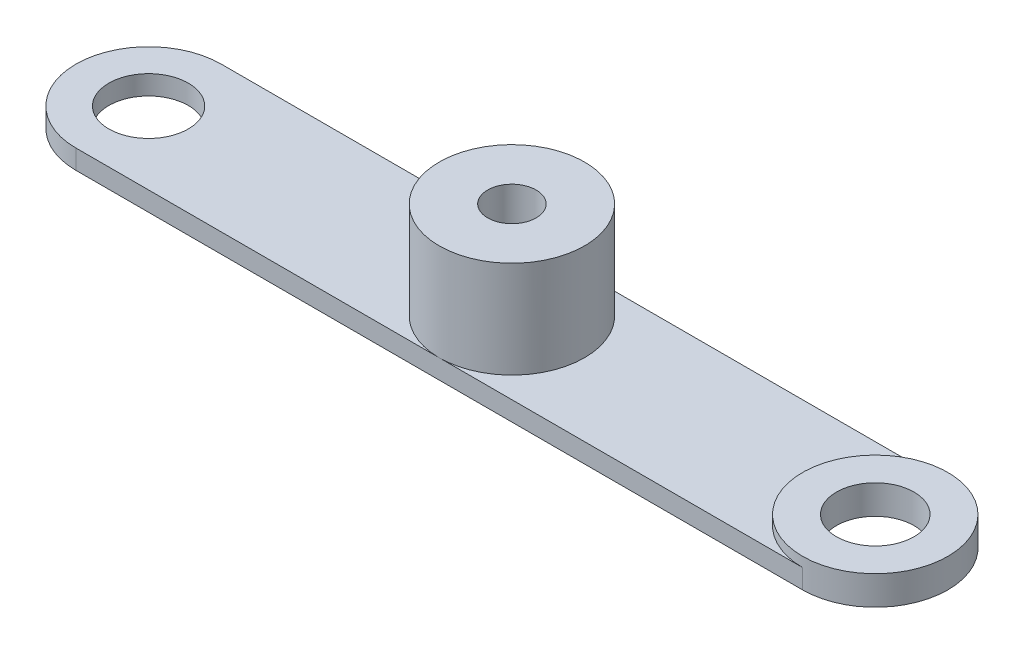
ISO-10303-21;
HEADER;
FILE_DESCRIPTION(('STEP AP214'),'2;1');
FILE_NAME('part.step','',(''),(''),'','','');
FILE_SCHEMA(('AUTOMOTIVE_DESIGN { 1 0 10303 214 1 1 1 1 }'));
ENDSEC;
DATA;
#1=APPLICATION_CONTEXT('core data for automotive mechanical design processes');
#2=APPLICATION_PROTOCOL_DEFINITION('international standard','automotive_design',2000,#1);
#3=PRODUCT_CONTEXT('',#1,'mechanical');
#4=PRODUCT('Part','Part','',(#3));
#5=PRODUCT_RELATED_PRODUCT_CATEGORY('part','',(#4));
#6=PRODUCT_DEFINITION_FORMATION('','',#4);
#7=PRODUCT_DEFINITION_CONTEXT('part definition',#1,'design');
#8=PRODUCT_DEFINITION('design','',#6,#7);
#9=PRODUCT_DEFINITION_SHAPE('','',#8);
#10=(LENGTH_UNIT() NAMED_UNIT(*) SI_UNIT(.MILLI.,.METRE.));
#11=(NAMED_UNIT(*) PLANE_ANGLE_UNIT() SI_UNIT($,.RADIAN.));
#12=(NAMED_UNIT(*) SI_UNIT($,.STERADIAN.) SOLID_ANGLE_UNIT());
#13=UNCERTAINTY_MEASURE_WITH_UNIT(LENGTH_MEASURE(1.E-05),#10,'distance_accuracy_value','');
#14=(GEOMETRIC_REPRESENTATION_CONTEXT(3) GLOBAL_UNCERTAINTY_ASSIGNED_CONTEXT((#13)) GLOBAL_UNIT_ASSIGNED_CONTEXT((#10,
#11,#12)) REPRESENTATION_CONTEXT('',''));
#15=CARTESIAN_POINT('',(0.,0.,0.));
#16=DIRECTION('',(0.,0.,1.));
#17=DIRECTION('',(1.,0.,0.));
#18=AXIS2_PLACEMENT_3D('',#15,#16,#17);
#19=CARTESIAN_POINT('',(-37.5,2.,0.));
#20=DIRECTION('',(0.,1.,0.));
#21=DIRECTION('',(0.,0.,1.));
#22=AXIS2_PLACEMENT_3D('',#19,#20,#21);
#23=PLANE('',#22);
#24=DIRECTION('',(1.,0.,0.));
#25=VECTOR('',#24,1.);
#26=CARTESIAN_POINT('',(-37.5,2.,7.5));
#27=LINE('',#26,#25);
#28=CARTESIAN_POINT('',(0.,2.,7.50000000000001));
#29=VERTEX_POINT('',#28);
#30=CARTESIAN_POINT('',(37.5,2.,7.5));
#31=VERTEX_POINT('',#30);
#32=EDGE_CURVE('E112',#29,#31,#27,.T.);
#33=ORIENTED_EDGE('',*,*,#32,.T.);
#34=CARTESIAN_POINT('',(37.5,2.,0.));
#35=DIRECTION('',(0.,1.,0.));
#36=DIRECTION('',(0.,0.,1.));
#37=AXIS2_PLACEMENT_3D('',#34,#35,#36);
#38=CIRCLE('',#37,7.50000000000001);
#39=CARTESIAN_POINT('',(37.5,2.,-7.50000000000001));
#40=VERTEX_POINT('',#39);
#41=EDGE_CURVE('E107',#40,#31,#38,.T.);
#42=ORIENTED_EDGE('',*,*,#41,.F.);
#43=DIRECTION('',(-1.,0.,0.));
#44=VECTOR('',#43,1.);
#45=CARTESIAN_POINT('',(-37.5,2.,-7.5));
#46=LINE('',#45,#44);
#47=CARTESIAN_POINT('',(0.,2.,-7.50000000000001));
#48=VERTEX_POINT('',#47);
#49=EDGE_CURVE('E92',#40,#48,#46,.T.);
#50=ORIENTED_EDGE('',*,*,#49,.T.);
#51=CARTESIAN_POINT('',(0.,2.,0.));
#52=DIRECTION('',(0.,1.,0.));
#53=DIRECTION('',(0.,0.,1.));
#54=AXIS2_PLACEMENT_3D('',#51,#52,#53);
#55=CIRCLE('',#54,7.50000000000001);
#56=EDGE_CURVE('E49',#29,#48,#55,.T.);
#57=ORIENTED_EDGE('',*,*,#56,.F.);
#58=EDGE_LOOP('',(#33,#42,#50,#57));
#59=FACE_BOUND('',#58,.T.);
#60=ADVANCED_FACE('F39',(#59),#23,.T.);
#61=EDGE_CURVE('E11',#48,#29,#55,.T.);
#62=ORIENTED_EDGE('',*,*,#61,.F.);
#63=CARTESIAN_POINT('',(-37.5,2.,-7.5));
#64=VERTEX_POINT('',#63);
#65=EDGE_CURVE('E59',#48,#64,#46,.T.);
#66=ORIENTED_EDGE('',*,*,#65,.T.);
#67=CARTESIAN_POINT('',(-37.5,2.,0.));
#68=DIRECTION('',(0.,1.,0.));
#69=DIRECTION('',(0.,0.,1.));
#70=AXIS2_PLACEMENT_3D('',#67,#68,#69);
#71=CIRCLE('',#70,7.5);
#72=CARTESIAN_POINT('',(-37.5,2.,7.5));
#73=VERTEX_POINT('',#72);
#74=EDGE_CURVE('E141',#64,#73,#71,.T.);
#75=ORIENTED_EDGE('',*,*,#74,.T.);
#76=EDGE_CURVE('E86',#73,#29,#27,.T.);
#77=ORIENTED_EDGE('',*,*,#76,.T.);
#78=EDGE_LOOP('',(#62,#66,#75,#77));
#79=FACE_BOUND('',#78,.T.);
#80=CARTESIAN_POINT('',(-37.5,2.,0.));
#81=DIRECTION('',(0.,1.,0.));
#82=DIRECTION('',(0.,0.,1.));
#83=AXIS2_PLACEMENT_3D('',#80,#81,#82);
#84=CIRCLE('',#83,4.1);
#85=CARTESIAN_POINT('',(-37.5,2.,4.1));
#86=VERTEX_POINT('',#85);
#87=EDGE_CURVE('E135',#86,#86,#84,.T.);
#88=ORIENTED_EDGE('',*,*,#87,.F.);
#89=EDGE_LOOP('',(#88));
#90=FACE_BOUND('',#89,.T.);
#91=ADVANCED_FACE('F159',(#79,#90),#23,.T.);
#92=CARTESIAN_POINT('',(-37.5,0.,0.));
#93=DIRECTION('',(0.,1.,0.));
#94=DIRECTION('',(0.,0.,1.));
#95=AXIS2_PLACEMENT_3D('',#92,#93,#94);
#96=PLANE('',#95);
#97=CARTESIAN_POINT('',(0.,0.,0.));
#98=DIRECTION('',(0.,1.,0.));
#99=DIRECTION('',(0.,0.,1.));
#100=AXIS2_PLACEMENT_3D('',#97,#98,#99);
#101=CIRCLE('',#100,2.5);
#102=CARTESIAN_POINT('',(0.,0.,2.5));
#103=VERTEX_POINT('',#102);
#104=EDGE_CURVE('E123',#103,#103,#101,.T.);
#105=ORIENTED_EDGE('',*,*,#104,.T.);
#106=EDGE_LOOP('',(#105));
#107=FACE_BOUND('',#106,.T.);
#108=CARTESIAN_POINT('',(-37.5,0.,0.));
#109=DIRECTION('',(0.,1.,0.));
#110=DIRECTION('',(0.,0.,1.));
#111=AXIS2_PLACEMENT_3D('',#108,#109,#110);
#112=CIRCLE('',#111,7.5);
#113=CARTESIAN_POINT('',(-37.5,0.,-7.5));
#114=VERTEX_POINT('',#113);
#115=CARTESIAN_POINT('',(-37.5,0.,7.5));
#116=VERTEX_POINT('',#115);
#117=EDGE_CURVE('E138',#114,#116,#112,.T.);
#118=ORIENTED_EDGE('',*,*,#117,.F.);
#119=DIRECTION('',(-1.,0.,0.));
#120=VECTOR('',#119,1.);
#121=CARTESIAN_POINT('',(-37.5,0.,-7.5));
#122=LINE('',#121,#120);
#123=CARTESIAN_POINT('',(37.5,0.,-7.50000000000001));
#124=VERTEX_POINT('',#123);
#125=EDGE_CURVE('E80',#124,#114,#122,.T.);
#126=ORIENTED_EDGE('',*,*,#125,.F.);
#127=CARTESIAN_POINT('',(37.5,0.,0.));
#128=DIRECTION('',(0.,1.,0.));
#129=DIRECTION('',(0.,0.,1.));
#130=AXIS2_PLACEMENT_3D('',#127,#128,#129);
#131=CIRCLE('',#130,7.5);
#132=CARTESIAN_POINT('',(37.5,0.,7.5));
#133=VERTEX_POINT('',#132);
#134=EDGE_CURVE('E109',#133,#124,#131,.T.);
#135=ORIENTED_EDGE('',*,*,#134,.F.);
#136=DIRECTION('',(1.,0.,0.));
#137=VECTOR('',#136,1.);
#138=CARTESIAN_POINT('',(-37.5,0.,7.5));
#139=LINE('',#138,#137);
#140=EDGE_CURVE('E146',#116,#133,#139,.T.);
#141=ORIENTED_EDGE('',*,*,#140,.F.);
#142=EDGE_LOOP('',(#118,#126,#135,#141));
#143=FACE_BOUND('',#142,.T.);
#144=CARTESIAN_POINT('',(-37.5,0.,0.));
#145=DIRECTION('',(0.,1.,0.));
#146=DIRECTION('',(0.,0.,1.));
#147=AXIS2_PLACEMENT_3D('',#144,#145,#146);
#148=CIRCLE('',#147,4.1);
#149=CARTESIAN_POINT('',(-37.5,0.,4.1));
#150=VERTEX_POINT('',#149);
#151=EDGE_CURVE('E134',#150,#150,#148,.T.);
#152=ORIENTED_EDGE('',*,*,#151,.T.);
#153=EDGE_LOOP('',(#152));
#154=FACE_BOUND('',#153,.T.);
#155=CARTESIAN_POINT('',(37.5,0.,0.));
#156=DIRECTION('',(0.,1.,0.));
#157=DIRECTION('',(0.,0.,1.));
#158=AXIS2_PLACEMENT_3D('',#155,#156,#157);
#159=CIRCLE('',#158,4.);
#160=CARTESIAN_POINT('',(37.5,0.,4.));
#161=VERTEX_POINT('',#160);
#162=EDGE_CURVE('E130',#161,#161,#159,.T.);
#163=ORIENTED_EDGE('',*,*,#162,.T.);
#164=EDGE_LOOP('',(#163));
#165=FACE_BOUND('',#164,.T.);
#166=ADVANCED_FACE('F156',(#107,#143,#154,#165),#96,.F.);
#167=CARTESIAN_POINT('',(-37.5,2.,0.));
#168=DIRECTION('',(0.,-1.,0.));
#169=DIRECTION('',(0.,0.,-1.));
#170=AXIS2_PLACEMENT_3D('',#167,#168,#169);
#171=CYLINDRICAL_SURFACE('',#170,7.5);
#172=ORIENTED_EDGE('',*,*,#117,.T.);
#173=DIRECTION('',(0.,-1.,0.));
#174=VECTOR('',#173,1.);
#175=CARTESIAN_POINT('',(-37.5,2.,7.5));
#176=LINE('',#175,#174);
#177=EDGE_CURVE('E43',#73,#116,#176,.T.);
#178=ORIENTED_EDGE('',*,*,#177,.F.);
#179=ORIENTED_EDGE('',*,*,#74,.F.);
#180=DIRECTION('',(0.,-1.,0.));
#181=VECTOR('',#180,1.);
#182=CARTESIAN_POINT('',(-37.5,2.,-7.5));
#183=LINE('',#182,#181);
#184=EDGE_CURVE('E100',#64,#114,#183,.T.);
#185=ORIENTED_EDGE('',*,*,#184,.T.);
#186=EDGE_LOOP('',(#172,#178,#179,#185));
#187=FACE_BOUND('',#186,.T.);
#188=ADVANCED_FACE('F41',(#187),#171,.T.);
#189=CARTESIAN_POINT('',(-37.5,2.,7.5));
#190=DIRECTION('',(0.,0.,-1.));
#191=DIRECTION('',(-1.,0.,0.));
#192=AXIS2_PLACEMENT_3D('',#189,#190,#191);
#193=PLANE('',#192);
#194=ORIENTED_EDGE('',*,*,#140,.T.);
#195=DIRECTION('',(0.,-1.,0.));
#196=VECTOR('',#195,1.);
#197=CARTESIAN_POINT('',(37.5,2.,7.5));
#198=LINE('',#197,#196);
#199=EDGE_CURVE('E110',#31,#133,#198,.T.);
#200=ORIENTED_EDGE('',*,*,#199,.F.);
#201=ORIENTED_EDGE('',*,*,#32,.F.);
#202=ORIENTED_EDGE('',*,*,#76,.F.);
#203=ORIENTED_EDGE('',*,*,#177,.T.);
#204=EDGE_LOOP('',(#194,#200,#201,#202,#203));
#205=FACE_BOUND('',#204,.T.);
#206=ADVANCED_FACE('F151',(#205),#193,.F.);
#207=CARTESIAN_POINT('',(37.5,2.,0.));
#208=DIRECTION('',(0.,-1.,0.));
#209=DIRECTION('',(0.,0.,-1.));
#210=AXIS2_PLACEMENT_3D('',#207,#208,#209);
#211=CYLINDRICAL_SURFACE('',#210,7.5);
#212=ORIENTED_EDGE('',*,*,#134,.T.);
#213=DIRECTION('',(0.,-1.,0.));
#214=VECTOR('',#213,1.);
#215=CARTESIAN_POINT('',(37.5,2.,-7.50000000000001));
#216=LINE('',#215,#214);
#217=EDGE_CURVE('E95',#40,#124,#216,.T.);
#218=ORIENTED_EDGE('',*,*,#217,.F.);
#219=ORIENTED_EDGE('',*,*,#41,.T.);
#220=ORIENTED_EDGE('',*,*,#199,.T.);
#221=EDGE_LOOP('',(#212,#218,#219,#220));
#222=FACE_BOUND('',#221,.T.);
#223=CARTESIAN_POINT('',(37.5,3.,0.));
#224=DIRECTION('',(0.,1.,0.));
#225=DIRECTION('',(0.,0.,1.));
#226=AXIS2_PLACEMENT_3D('',#223,#224,#225);
#227=CIRCLE('',#226,7.50000000000001);
#228=CARTESIAN_POINT('',(37.5,3.,7.50000000000001));
#229=VERTEX_POINT('',#228);
#230=EDGE_CURVE('E114',#229,#229,#227,.T.);
#231=ORIENTED_EDGE('',*,*,#230,.F.);
#232=EDGE_LOOP('',(#231));
#233=FACE_BOUND('',#232,.T.);
#234=ADVANCED_FACE('F104',(#222,#233),#211,.T.);
#235=CARTESIAN_POINT('',(-37.5,2.,-7.5));
#236=DIRECTION('',(0.,0.,1.));
#237=DIRECTION('',(1.,0.,0.));
#238=AXIS2_PLACEMENT_3D('',#235,#236,#237);
#239=PLANE('',#238);
#240=ORIENTED_EDGE('',*,*,#125,.T.);
#241=ORIENTED_EDGE('',*,*,#184,.F.);
#242=ORIENTED_EDGE('',*,*,#65,.F.);
#243=ORIENTED_EDGE('',*,*,#49,.F.);
#244=ORIENTED_EDGE('',*,*,#217,.T.);
#245=EDGE_LOOP('',(#240,#241,#242,#243,#244));
#246=FACE_BOUND('',#245,.T.);
#247=ADVANCED_FACE('F94',(#246),#239,.F.);
#248=CARTESIAN_POINT('',(-37.5,2.,0.));
#249=DIRECTION('',(0.,-1.,0.));
#250=DIRECTION('',(0.,0.,-1.));
#251=AXIS2_PLACEMENT_3D('',#248,#249,#250);
#252=CYLINDRICAL_SURFACE('',#251,4.1);
#253=ORIENTED_EDGE('',*,*,#87,.T.);
#254=EDGE_LOOP('',(#253));
#255=FACE_BOUND('',#254,.T.);
#256=ORIENTED_EDGE('',*,*,#151,.F.);
#257=EDGE_LOOP('',(#256));
#258=FACE_BOUND('',#257,.T.);
#259=ADVANCED_FACE('F170',(#255,#258),#252,.F.);
#260=CARTESIAN_POINT('',(37.5,2.,0.));
#261=DIRECTION('',(0.,-1.,0.));
#262=DIRECTION('',(0.,0.,-1.));
#263=AXIS2_PLACEMENT_3D('',#260,#261,#262);
#264=CYLINDRICAL_SURFACE('',#263,4.);
#265=ORIENTED_EDGE('',*,*,#162,.F.);
#266=EDGE_LOOP('',(#265));
#267=FACE_BOUND('',#266,.T.);
#268=CARTESIAN_POINT('',(37.5,3.,0.));
#269=DIRECTION('',(0.,1.,0.));
#270=DIRECTION('',(0.,0.,1.));
#271=AXIS2_PLACEMENT_3D('',#268,#269,#270);
#272=CIRCLE('',#271,4.);
#273=CARTESIAN_POINT('',(37.5,3.,4.));
#274=VERTEX_POINT('',#273);
#275=EDGE_CURVE('E115',#274,#274,#272,.T.);
#276=ORIENTED_EDGE('',*,*,#275,.T.);
#277=EDGE_LOOP('',(#276));
#278=FACE_BOUND('',#277,.T.);
#279=ADVANCED_FACE('F166',(#267,#278),#264,.F.);
#280=CARTESIAN_POINT('',(0.,12.,0.));
#281=DIRECTION('',(0.,-1.,0.));
#282=DIRECTION('',(0.,0.,-1.));
#283=AXIS2_PLACEMENT_3D('',#280,#281,#282);
#284=CYLINDRICAL_SURFACE('',#283,7.50000000000001);
#285=CARTESIAN_POINT('',(0.,12.,0.));
#286=DIRECTION('',(0.,1.,0.));
#287=DIRECTION('',(0.,0.,1.));
#288=AXIS2_PLACEMENT_3D('',#285,#286,#287);
#289=CIRCLE('',#288,7.50000000000001);
#290=CARTESIAN_POINT('',(0.,12.,7.50000000000001));
#291=VERTEX_POINT('',#290);
#292=EDGE_CURVE('E128',#291,#291,#289,.T.);
#293=ORIENTED_EDGE('',*,*,#292,.F.);
#294=EDGE_LOOP('',(#293));
#295=FACE_BOUND('',#294,.T.);
#296=ORIENTED_EDGE('',*,*,#56,.T.);
#297=ORIENTED_EDGE('',*,*,#61,.T.);
#298=EDGE_LOOP('',(#296,#297));
#299=FACE_BOUND('',#298,.T.);
#300=ADVANCED_FACE('F169',(#295,#299),#284,.T.);
#301=CARTESIAN_POINT('',(0.,12.,0.));
#302=DIRECTION('',(0.,1.,0.));
#303=DIRECTION('',(0.,0.,1.));
#304=AXIS2_PLACEMENT_3D('',#301,#302,#303);
#305=PLANE('',#304);
#306=CARTESIAN_POINT('',(0.,12.,0.));
#307=DIRECTION('',(0.,1.,0.));
#308=DIRECTION('',(0.,0.,1.));
#309=AXIS2_PLACEMENT_3D('',#306,#307,#308);
#310=CIRCLE('',#309,2.5);
#311=CARTESIAN_POINT('',(0.,12.,2.5));
#312=VERTEX_POINT('',#311);
#313=EDGE_CURVE('E118',#312,#312,#310,.T.);
#314=ORIENTED_EDGE('',*,*,#313,.F.);
#315=EDGE_LOOP('',(#314));
#316=FACE_BOUND('',#315,.T.);
#317=ORIENTED_EDGE('',*,*,#292,.T.);
#318=EDGE_LOOP('',(#317));
#319=FACE_BOUND('',#318,.T.);
#320=ADVANCED_FACE('F182',(#316,#319),#305,.T.);
#321=CARTESIAN_POINT('',(0.,0.,0.));
#322=DIRECTION('',(0.,1.,0.));
#323=DIRECTION('',(0.,0.,1.));
#324=AXIS2_PLACEMENT_3D('',#321,#322,#323);
#325=CYLINDRICAL_SURFACE('',#324,2.5);
#326=ORIENTED_EDGE('',*,*,#104,.F.);
#327=EDGE_LOOP('',(#326));
#328=FACE_BOUND('',#327,.T.);
#329=ORIENTED_EDGE('',*,*,#313,.T.);
#330=EDGE_LOOP('',(#329));
#331=FACE_BOUND('',#330,.T.);
#332=ADVANCED_FACE('F176',(#328,#331),#325,.F.);
#333=CARTESIAN_POINT('',(37.5,3.,0.));
#334=DIRECTION('',(0.,1.,0.));
#335=DIRECTION('',(0.,0.,1.));
#336=AXIS2_PLACEMENT_3D('',#333,#334,#335);
#337=PLANE('',#336);
#338=ORIENTED_EDGE('',*,*,#230,.T.);
#339=EDGE_LOOP('',(#338));
#340=FACE_BOUND('',#339,.T.);
#341=ORIENTED_EDGE('',*,*,#275,.F.);
#342=EDGE_LOOP('',(#341));
#343=FACE_BOUND('',#342,.T.);
#344=ADVANCED_FACE('F174',(#340,#343),#337,.T.);
#345=CLOSED_SHELL('',(#60,#91,#166,#188,#206,#234,#247,#259,#279,#300,#320,#332,#344));
#346=MANIFOLD_SOLID_BREP('B2',#345);
#347=ADVANCED_BREP_SHAPE_REPRESENTATION('',(#18,#346),#14);
#348=SHAPE_DEFINITION_REPRESENTATION(#9,#347);
ENDSEC;
END-ISO-10303-21;
